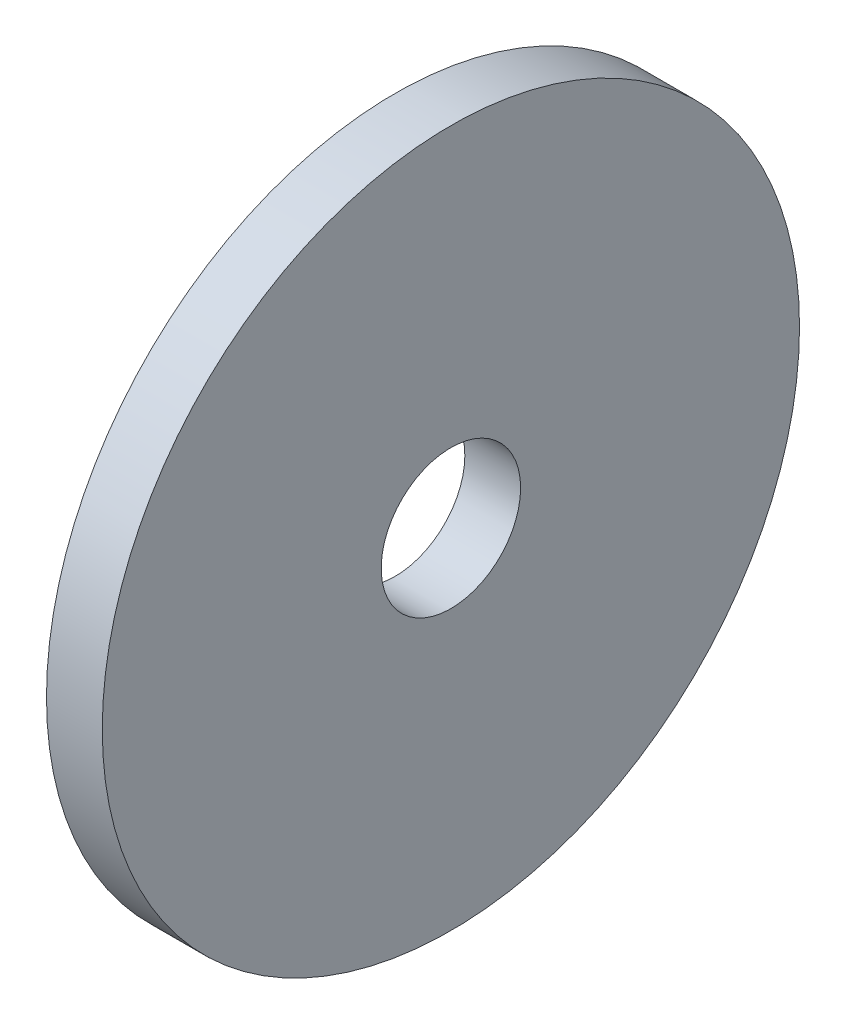
ISO-10303-21;
HEADER;
FILE_DESCRIPTION(('STEP AP214'),'2;1');
FILE_NAME('part.step','',(''),(''),'','','');
FILE_SCHEMA(('AUTOMOTIVE_DESIGN { 1 0 10303 214 1 1 1 1 }'));
ENDSEC;
DATA;
#1=APPLICATION_CONTEXT('core data for automotive mechanical design processes');
#2=APPLICATION_PROTOCOL_DEFINITION('international standard','automotive_design',2000,#1);
#3=PRODUCT_CONTEXT('',#1,'mechanical');
#4=PRODUCT('Part','Part','',(#3));
#5=PRODUCT_RELATED_PRODUCT_CATEGORY('part','',(#4));
#6=PRODUCT_DEFINITION_FORMATION('','',#4);
#7=PRODUCT_DEFINITION_CONTEXT('part definition',#1,'design');
#8=PRODUCT_DEFINITION('design','',#6,#7);
#9=PRODUCT_DEFINITION_SHAPE('','',#8);
#10=(LENGTH_UNIT() NAMED_UNIT(*) SI_UNIT(.MILLI.,.METRE.));
#11=(NAMED_UNIT(*) PLANE_ANGLE_UNIT() SI_UNIT($,.RADIAN.));
#12=(NAMED_UNIT(*) SI_UNIT($,.STERADIAN.) SOLID_ANGLE_UNIT());
#13=UNCERTAINTY_MEASURE_WITH_UNIT(LENGTH_MEASURE(1.E-05),#10,'distance_accuracy_value','');
#14=(GEOMETRIC_REPRESENTATION_CONTEXT(3) GLOBAL_UNCERTAINTY_ASSIGNED_CONTEXT((#13)) GLOBAL_UNIT_ASSIGNED_CONTEXT((#10,
#11,#12)) REPRESENTATION_CONTEXT('',''));
#15=CARTESIAN_POINT('',(0.,0.,0.));
#16=DIRECTION('',(0.,0.,1.));
#17=DIRECTION('',(1.,0.,0.));
#18=AXIS2_PLACEMENT_3D('',#15,#16,#17);
#19=CARTESIAN_POINT('',(2.54,0.,0.));
#20=DIRECTION('',(1.,0.,0.));
#21=DIRECTION('',(0.,0.,-1.));
#22=AXIS2_PLACEMENT_3D('',#19,#20,#21);
#23=PLANE('',#22);
#24=CARTESIAN_POINT('',(2.54,0.,0.));
#25=DIRECTION('',(1.,0.,0.));
#26=DIRECTION('',(0.,0.,-1.));
#27=AXIS2_PLACEMENT_3D('',#24,#25,#26);
#28=CIRCLE('',#27,15.875);
#29=CARTESIAN_POINT('',(2.54,0.,-15.875));
#30=VERTEX_POINT('',#29);
#31=EDGE_CURVE('E10',#30,#30,#28,.T.);
#32=ORIENTED_EDGE('',*,*,#31,.T.);
#33=EDGE_LOOP('',(#32));
#34=FACE_BOUND('',#33,.T.);
#35=CARTESIAN_POINT('',(2.54,0.,0.));
#36=DIRECTION('',(1.,0.,0.));
#37=DIRECTION('',(0.,0.,-1.));
#38=AXIS2_PLACEMENT_3D('',#35,#36,#37);
#39=CIRCLE('',#38,3.175);
#40=CARTESIAN_POINT('',(2.54,0.,-3.175));
#41=VERTEX_POINT('',#40);
#42=EDGE_CURVE('E50',#41,#41,#39,.T.);
#43=ORIENTED_EDGE('',*,*,#42,.F.);
#44=EDGE_LOOP('',(#43));
#45=FACE_BOUND('',#44,.T.);
#46=ADVANCED_FACE('F39',(#34,#45),#23,.T.);
#47=CARTESIAN_POINT('',(0.,0.,0.));
#48=DIRECTION('',(1.,0.,0.));
#49=DIRECTION('',(0.,0.,-1.));
#50=AXIS2_PLACEMENT_3D('',#47,#48,#49);
#51=PLANE('',#50);
#52=CARTESIAN_POINT('',(0.,0.,0.));
#53=DIRECTION('',(1.,0.,0.));
#54=DIRECTION('',(0.,0.,-1.));
#55=AXIS2_PLACEMENT_3D('',#52,#53,#54);
#56=CIRCLE('',#55,15.875);
#57=CARTESIAN_POINT('',(0.,0.,-15.875));
#58=VERTEX_POINT('',#57);
#59=EDGE_CURVE('E43',#58,#58,#56,.T.);
#60=ORIENTED_EDGE('',*,*,#59,.F.);
#61=EDGE_LOOP('',(#60));
#62=FACE_BOUND('',#61,.T.);
#63=CARTESIAN_POINT('',(0.,0.,0.));
#64=DIRECTION('',(1.,0.,0.));
#65=DIRECTION('',(0.,0.,-1.));
#66=AXIS2_PLACEMENT_3D('',#63,#64,#65);
#67=CIRCLE('',#66,3.175);
#68=CARTESIAN_POINT('',(0.,0.,-3.175));
#69=VERTEX_POINT('',#68);
#70=EDGE_CURVE('E52',#69,#69,#67,.T.);
#71=ORIENTED_EDGE('',*,*,#70,.T.);
#72=EDGE_LOOP('',(#71));
#73=FACE_BOUND('',#72,.T.);
#74=ADVANCED_FACE('F62',(#62,#73),#51,.F.);
#75=CARTESIAN_POINT('',(2.54,0.,0.));
#76=DIRECTION('',(-1.,0.,0.));
#77=DIRECTION('',(0.,0.,1.));
#78=AXIS2_PLACEMENT_3D('',#75,#76,#77);
#79=CYLINDRICAL_SURFACE('',#78,15.875);
#80=ORIENTED_EDGE('',*,*,#31,.F.);
#81=EDGE_LOOP('',(#80));
#82=FACE_BOUND('',#81,.T.);
#83=ORIENTED_EDGE('',*,*,#59,.T.);
#84=EDGE_LOOP('',(#83));
#85=FACE_BOUND('',#84,.T.);
#86=ADVANCED_FACE('F41',(#82,#85),#79,.T.);
#87=CARTESIAN_POINT('',(2.54,0.,0.));
#88=DIRECTION('',(-1.,0.,0.));
#89=DIRECTION('',(0.,0.,1.));
#90=AXIS2_PLACEMENT_3D('',#87,#88,#89);
#91=CYLINDRICAL_SURFACE('',#90,3.175);
#92=ORIENTED_EDGE('',*,*,#42,.T.);
#93=EDGE_LOOP('',(#92));
#94=FACE_BOUND('',#93,.T.);
#95=ORIENTED_EDGE('',*,*,#70,.F.);
#96=EDGE_LOOP('',(#95));
#97=FACE_BOUND('',#96,.T.);
#98=ADVANCED_FACE('F58',(#94,#97),#91,.F.);
#99=CLOSED_SHELL('',(#46,#74,#86,#98));
#100=MANIFOLD_SOLID_BREP('B2',#99);
#101=ADVANCED_BREP_SHAPE_REPRESENTATION('',(#18,#100),#14);
#102=SHAPE_DEFINITION_REPRESENTATION(#9,#101);
ENDSEC;
END-ISO-10303-21;
